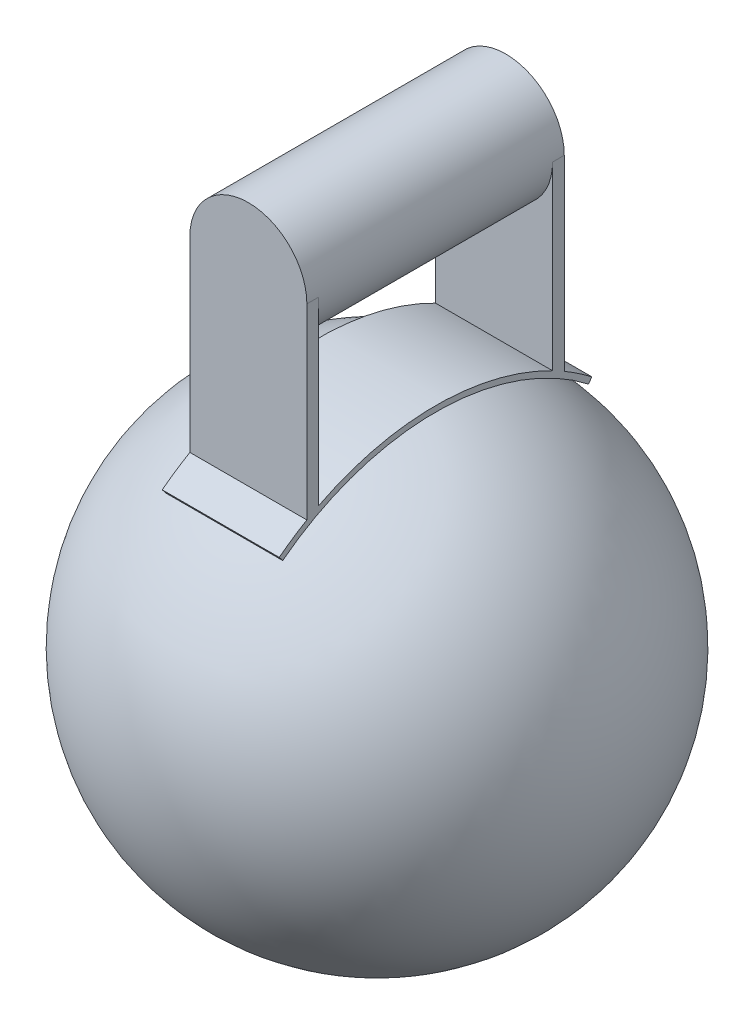
ISO-10303-21;
HEADER;
FILE_DESCRIPTION(('STEP AP214'),'2;1');
FILE_NAME('part.step','',(''),(''),'','','');
FILE_SCHEMA(('AUTOMOTIVE_DESIGN { 1 0 10303 214 1 1 1 1 }'));
ENDSEC;
DATA;
#1=APPLICATION_CONTEXT('core data for automotive mechanical design processes');
#2=APPLICATION_PROTOCOL_DEFINITION('international standard','automotive_design',2000,#1);
#3=PRODUCT_CONTEXT('',#1,'mechanical');
#4=PRODUCT('Part','Part','',(#3));
#5=PRODUCT_RELATED_PRODUCT_CATEGORY('part','',(#4));
#6=PRODUCT_DEFINITION_FORMATION('','',#4);
#7=PRODUCT_DEFINITION_CONTEXT('part definition',#1,'design');
#8=PRODUCT_DEFINITION('design','',#6,#7);
#9=PRODUCT_DEFINITION_SHAPE('','',#8);
#10=(LENGTH_UNIT() NAMED_UNIT(*) SI_UNIT(.MILLI.,.METRE.));
#11=(NAMED_UNIT(*) PLANE_ANGLE_UNIT() SI_UNIT($,.RADIAN.));
#12=(NAMED_UNIT(*) SI_UNIT($,.STERADIAN.) SOLID_ANGLE_UNIT());
#13=UNCERTAINTY_MEASURE_WITH_UNIT(LENGTH_MEASURE(1.E-05),#10,'distance_accuracy_value','');
#14=(GEOMETRIC_REPRESENTATION_CONTEXT(3) GLOBAL_UNCERTAINTY_ASSIGNED_CONTEXT((#13)) GLOBAL_UNIT_ASSIGNED_CONTEXT((#10,
#11,#12)) REPRESENTATION_CONTEXT('',''));
#15=CARTESIAN_POINT('',(0.,0.,0.));
#16=DIRECTION('',(0.,0.,1.));
#17=DIRECTION('',(1.,0.,0.));
#18=AXIS2_PLACEMENT_3D('',#15,#16,#17);
#19=CARTESIAN_POINT('',(560.90572399954,797.049874778435,1361.72805948292));
#20=DIRECTION('',(-3.47166739800286E-11,1.,0.));
#21=DIRECTION('',(-1.,-3.47166739800286E-11,0.));
#22=AXIS2_PLACEMENT_3D('',#19,#20,#21);
#23=SPHERICAL_SURFACE('',#22,20.);
#24=CARTESIAN_POINT('',(560.905723998846,817.049874778435,1361.72805948292));
#25=VERTEX_POINT('',#24);
#26=VERTEX_LOOP('',#25);
#27=FACE_BOUND('',#26,.T.);
#28=ADVANCED_FACE('F121',(#27),#23,.T.);
#29=CLOSED_SHELL('',(#28));
#30=MANIFOLD_SOLID_BREP('B2',#29);
#31=CARTESIAN_POINT('',(560.905723998939,830.454997706051,1371.72805948292));
#32=DIRECTION('',(0.,0.,-1.));
#33=DIRECTION('',(0.,1.,0.));
#34=AXIS2_PLACEMENT_3D('',#31,#32,#33);
#35=CYLINDRICAL_SURFACE('',#34,5.00000000038899);
#36=CARTESIAN_POINT('',(560.905723998939,830.454997706051,1371.72805948292));
#37=DIRECTION('',(0.,0.,1.));
#38=DIRECTION('',(0.,-1.,0.));
#39=AXIS2_PLACEMENT_3D('',#36,#37,#38);
#40=CIRCLE('',#39,5.00000000038899);
#41=CARTESIAN_POINT('',(555.905723998939,830.454997706051,1371.72805948292));
#42=VERTEX_POINT('',#41);
#43=CARTESIAN_POINT('',(565.905723999329,830.454997706051,1371.72805948291));
#44=VERTEX_POINT('',#43);
#45=EDGE_CURVE('E141',#42,#44,#40,.T.);
#46=ORIENTED_EDGE('',*,*,#45,.F.);
#47=DIRECTION('',(0.,0.,-1.));
#48=VECTOR('',#47,1.);
#49=CARTESIAN_POINT('',(555.90572399855,830.454997706051,1372.72805948291));
#50=LINE('',#49,#48);
#51=CARTESIAN_POINT('',(555.90572399855,830.454997706051,1372.72805948291));
#52=VERTEX_POINT('',#51);
#53=EDGE_CURVE('E306',#52,#42,#50,.T.);
#54=ORIENTED_EDGE('',*,*,#53,.F.);
#55=CARTESIAN_POINT('',(560.905723998939,830.454997706051,1372.72805948291));
#56=DIRECTION('',(0.,0.,1.));
#57=DIRECTION('',(1.,0.,0.));
#58=AXIS2_PLACEMENT_3D('',#55,#56,#57);
#59=CIRCLE('',#58,5.00000000038899);
#60=CARTESIAN_POINT('',(565.905723999329,830.454997706051,1372.72805948291));
#61=VERTEX_POINT('',#60);
#62=EDGE_CURVE('E288',#61,#52,#59,.T.);
#63=ORIENTED_EDGE('',*,*,#62,.F.);
#64=DIRECTION('',(0.,0.,-1.));
#65=VECTOR('',#64,1.);
#66=CARTESIAN_POINT('',(565.905723999329,830.454997706051,1372.72805948291));
#67=LINE('',#66,#65);
#68=EDGE_CURVE('E300',#61,#44,#67,.T.);
#69=ORIENTED_EDGE('',*,*,#68,.T.);
#70=EDGE_LOOP('',(#46,#54,#63,#69));
#71=FACE_BOUND('',#70,.T.);
#72=CARTESIAN_POINT('',(560.905723998939,830.454997706051,1351.72805948292));
#73=DIRECTION('',(0.,0.,1.));
#74=DIRECTION('',(0.,-1.,0.));
#75=AXIS2_PLACEMENT_3D('',#72,#73,#74);
#76=CIRCLE('',#75,5.00000000038899);
#77=CARTESIAN_POINT('',(555.90572399855,830.454997706051,1351.72805948292));
#78=VERTEX_POINT('',#77);
#79=CARTESIAN_POINT('',(565.905723998939,830.454997706051,1351.72805948292));
#80=VERTEX_POINT('',#79);
#81=EDGE_CURVE('E309',#78,#80,#76,.T.);
#82=ORIENTED_EDGE('',*,*,#81,.T.);
#83=DIRECTION('',(0.,0.,1.));
#84=VECTOR('',#83,1.);
#85=CARTESIAN_POINT('',(565.905723999329,830.454997706051,1350.72805948292));
#86=LINE('',#85,#84);
#87=CARTESIAN_POINT('',(565.905723999329,830.454997706051,1350.72805948292));
#88=VERTEX_POINT('',#87);
#89=EDGE_CURVE('E285',#88,#80,#86,.T.);
#90=ORIENTED_EDGE('',*,*,#89,.F.);
#91=CARTESIAN_POINT('',(560.905723998939,830.454997706051,1350.72805948292));
#92=DIRECTION('',(0.,0.,1.));
#93=DIRECTION('',(1.,0.,0.));
#94=AXIS2_PLACEMENT_3D('',#91,#92,#93);
#95=CIRCLE('',#94,5.00000000038899);
#96=CARTESIAN_POINT('',(555.90572399855,830.454997706051,1350.72805948292));
#97=VERTEX_POINT('',#96);
#98=EDGE_CURVE('E267',#88,#97,#95,.T.);
#99=ORIENTED_EDGE('',*,*,#98,.T.);
#100=DIRECTION('',(0.,0.,1.));
#101=VECTOR('',#100,1.);
#102=CARTESIAN_POINT('',(555.90572399855,830.454997706051,1350.72805948292));
#103=LINE('',#102,#101);
#104=EDGE_CURVE('E279',#97,#78,#103,.T.);
#105=ORIENTED_EDGE('',*,*,#104,.T.);
#106=EDGE_LOOP('',(#82,#90,#99,#105));
#107=FACE_BOUND('',#106,.T.);
#108=ADVANCED_FACE('F134',(#71,#107),#35,.T.);
#109=CARTESIAN_POINT('',(0.,0.,1371.72805948291));
#110=DIRECTION('',(0.,0.,1.));
#111=DIRECTION('',(1.,0.,0.));
#112=AXIS2_PLACEMENT_3D('',#109,#110,#111);
#113=PLANE('',#112);
#114=DIRECTION('',(0.,-1.,0.));
#115=VECTOR('',#114,1.);
#116=CARTESIAN_POINT('',(565.905723998939,0.,1371.72805948291));
#117=LINE('',#116,#115);
#118=CARTESIAN_POINT('',(565.905723998932,815.009793199456,1371.72805948291));
#119=VERTEX_POINT('',#118);
#120=EDGE_CURVE('E292',#44,#119,#117,.T.);
#121=ORIENTED_EDGE('',*,*,#120,.T.);
#122=DIRECTION('',(-1.,0.,0.));
#123=VECTOR('',#122,1.);
#124=CARTESIAN_POINT('',(565.905723998932,815.009793199456,1371.72805948291));
#125=LINE('',#124,#123);
#126=CARTESIAN_POINT('',(555.905723998932,815.009793199456,1371.72805948291));
#127=VERTEX_POINT('',#126);
#128=EDGE_CURVE('E249',#119,#127,#125,.T.);
#129=ORIENTED_EDGE('',*,*,#128,.T.);
#130=DIRECTION('',(0.,-1.,0.));
#131=VECTOR('',#130,1.);
#132=CARTESIAN_POINT('',(555.905723998939,0.,1371.72805948291));
#133=LINE('',#132,#131);
#134=EDGE_CURVE('E287',#42,#127,#133,.T.);
#135=ORIENTED_EDGE('',*,*,#134,.F.);
#136=ORIENTED_EDGE('',*,*,#45,.T.);
#137=EDGE_LOOP('',(#121,#129,#135,#136));
#138=FACE_BOUND('',#137,.T.);
#139=ADVANCED_FACE('F349',(#138),#113,.F.);
#140=CARTESIAN_POINT('',(555.905723998939,0.,1372.72805948291));
#141=DIRECTION('',(1.,0.,0.));
#142=DIRECTION('',(0.,0.,-1.));
#143=AXIS2_PLACEMENT_3D('',#140,#141,#142);
#144=PLANE('',#143);
#145=ORIENTED_EDGE('',*,*,#134,.T.);
#146=CARTESIAN_POINT('',(555.905723998932,795.548487920204,1361.72805948291));
#147=DIRECTION('',(-1.,0.,0.));
#148=DIRECTION('',(0.,0.,1.));
#149=AXIS2_PLACEMENT_3D('',#146,#147,#148);
#150=CIRCLE('',#149,21.880182887086);
#151=CARTESIAN_POINT('',(555.905723998932,815.009793199466,1351.72805948292));
#152=VERTEX_POINT('',#151);
#153=EDGE_CURVE('E318',#127,#152,#150,.T.);
#154=ORIENTED_EDGE('',*,*,#153,.T.);
#155=DIRECTION('',(0.,-1.,0.));
#156=VECTOR('',#155,1.);
#157=CARTESIAN_POINT('',(555.905723998939,1.59916102906686E-13,1351.72805948291));
#158=LINE('',#157,#156);
#159=EDGE_CURVE('E271',#78,#152,#158,.T.);
#160=ORIENTED_EDGE('',*,*,#159,.F.);
#161=ORIENTED_EDGE('',*,*,#104,.F.);
#162=DIRECTION('',(0.,-1.,0.));
#163=VECTOR('',#162,1.);
#164=CARTESIAN_POINT('',(555.905723998939,1.75907713197352E-13,1350.72805948291));
#165=LINE('',#164,#163);
#166=CARTESIAN_POINT('',(555.905723998932,814.462567415983,1350.72805948292));
#167=VERTEX_POINT('',#166);
#168=EDGE_CURVE('E276',#97,#167,#165,.T.);
#169=ORIENTED_EDGE('',*,*,#168,.T.);
#170=CARTESIAN_POINT('',(555.905723998932,812.875739584183,1348.36734270029));
#171=VERTEX_POINT('',#170);
#172=EDGE_CURVE('E320',#167,#171,#150,.T.);
#173=ORIENTED_EDGE('',*,*,#172,.T.);
#174=DIRECTION('',(0.,-0.791915303149285,0.6106309463481));
#175=VECTOR('',#174,1.);
#176=CARTESIAN_POINT('',(555.905723998932,955.124388120012,1238.68209413047));
#177=LINE('',#176,#175);
#178=CARTESIAN_POINT('',(555.905723998932,812.491448801711,1348.66366207086));
#179=VERTEX_POINT('',#178);
#180=EDGE_CURVE('E258',#171,#179,#177,.T.);
#181=ORIENTED_EDGE('',*,*,#180,.T.);
#182=CARTESIAN_POINT('',(555.905723998932,795.548487920204,1361.72805948291));
#183=DIRECTION('',(-1.,0.,0.));
#184=DIRECTION('',(0.,0.,1.));
#185=AXIS2_PLACEMENT_3D('',#182,#183,#184);
#186=CIRCLE('',#185,21.3949153579147);
#187=CARTESIAN_POINT('',(555.905723998932,812.491448801711,1374.79245689497));
#188=VERTEX_POINT('',#187);
#189=EDGE_CURVE('E262',#188,#179,#186,.T.);
#190=ORIENTED_EDGE('',*,*,#189,.F.);
#191=DIRECTION('',(0.,-0.791915303149285,-0.6106309463481));
#192=VECTOR('',#191,1.);
#193=CARTESIAN_POINT('',(555.905723998932,-361.851815876597,469.278526053737));
#194=LINE('',#193,#192);
#195=CARTESIAN_POINT('',(555.905723998932,812.875739584183,1375.08877626553));
#196=VERTEX_POINT('',#195);
#197=EDGE_CURVE('E246',#196,#188,#194,.T.);
#198=ORIENTED_EDGE('',*,*,#197,.F.);
#199=CARTESIAN_POINT('',(555.905723998932,814.462567415972,1372.72805948291));
#200=VERTEX_POINT('',#199);
#201=EDGE_CURVE('E234',#196,#200,#150,.T.);
#202=ORIENTED_EDGE('',*,*,#201,.T.);
#203=DIRECTION('',(0.,-1.,0.));
#204=VECTOR('',#203,1.);
#205=CARTESIAN_POINT('',(555.905723998939,0.,1372.72805948291));
#206=LINE('',#205,#204);
#207=EDGE_CURVE('E291',#52,#200,#206,.T.);
#208=ORIENTED_EDGE('',*,*,#207,.F.);
#209=ORIENTED_EDGE('',*,*,#53,.T.);
#210=EDGE_LOOP('',(#145,#154,#160,#161,#169,#173,#181,#190,#198,#202,#208,#209));
#211=FACE_BOUND('',#210,.T.);
#212=ADVANCED_FACE('F317',(#211),#144,.F.);
#213=CARTESIAN_POINT('',(565.905723998939,0.,1372.72805948291));
#214=DIRECTION('',(1.,0.,0.));
#215=DIRECTION('',(0.,0.,-1.));
#216=AXIS2_PLACEMENT_3D('',#213,#214,#215);
#217=PLANE('',#216);
#218=DIRECTION('',(0.,-1.,0.));
#219=VECTOR('',#218,1.);
#220=CARTESIAN_POINT('',(565.905723998939,0.,1372.72805948291));
#221=LINE('',#220,#219);
#222=CARTESIAN_POINT('',(565.905723998939,814.462567416319,1372.72805948291));
#223=VERTEX_POINT('',#222);
#224=EDGE_CURVE('E298',#61,#223,#221,.T.);
#225=ORIENTED_EDGE('',*,*,#224,.T.);
#226=CARTESIAN_POINT('',(565.905723998932,795.548487920204,1361.72805948291));
#227=DIRECTION('',(-1.,0.,0.));
#228=DIRECTION('',(0.,0.,1.));
#229=AXIS2_PLACEMENT_3D('',#226,#227,#228);
#230=CIRCLE('',#229,21.880182887086);
#231=CARTESIAN_POINT('',(565.905723998932,812.875739584183,1375.08877626553));
#232=VERTEX_POINT('',#231);
#233=EDGE_CURVE('E240',#232,#223,#230,.T.);
#234=ORIENTED_EDGE('',*,*,#233,.F.);
#235=DIRECTION('',(0.,-0.791915303149285,-0.6106309463481));
#236=VECTOR('',#235,1.);
#237=CARTESIAN_POINT('',(565.905723998932,-361.851815876597,469.278526053737));
#238=LINE('',#237,#236);
#239=CARTESIAN_POINT('',(565.905723998932,812.491448801711,1374.79245689497));
#240=VERTEX_POINT('',#239);
#241=EDGE_CURVE('E233',#232,#240,#238,.T.);
#242=ORIENTED_EDGE('',*,*,#241,.T.);
#243=CARTESIAN_POINT('',(565.905723998932,795.548487920204,1361.72805948291));
#244=DIRECTION('',(-1.,0.,0.));
#245=DIRECTION('',(0.,0.,1.));
#246=AXIS2_PLACEMENT_3D('',#243,#244,#245);
#247=CIRCLE('',#246,21.3949153579147);
#248=CARTESIAN_POINT('',(565.905723998932,812.491448801711,1348.66366207086));
#249=VERTEX_POINT('',#248);
#250=EDGE_CURVE('E222',#240,#249,#247,.T.);
#251=ORIENTED_EDGE('',*,*,#250,.T.);
#252=DIRECTION('',(0.,-0.791915303149285,0.6106309463481));
#253=VECTOR('',#252,1.);
#254=CARTESIAN_POINT('',(565.905723998932,955.124388120012,1238.68209413047));
#255=LINE('',#254,#253);
#256=CARTESIAN_POINT('',(565.905723998932,812.875739584183,1348.36734270029));
#257=VERTEX_POINT('',#256);
#258=EDGE_CURVE('E255',#257,#249,#255,.T.);
#259=ORIENTED_EDGE('',*,*,#258,.F.);
#260=CARTESIAN_POINT('',(565.905723998932,814.462567415983,1350.72805948292));
#261=VERTEX_POINT('',#260);
#262=EDGE_CURVE('E242',#261,#257,#230,.T.);
#263=ORIENTED_EDGE('',*,*,#262,.F.);
#264=DIRECTION('',(0.,-1.,0.));
#265=VECTOR('',#264,1.);
#266=CARTESIAN_POINT('',(565.905723998939,1.75907713197352E-13,1350.72805948291));
#267=LINE('',#266,#265);
#268=EDGE_CURVE('E270',#88,#261,#267,.T.);
#269=ORIENTED_EDGE('',*,*,#268,.F.);
#270=ORIENTED_EDGE('',*,*,#89,.T.);
#271=DIRECTION('',(0.,-1.,0.));
#272=VECTOR('',#271,1.);
#273=CARTESIAN_POINT('',(565.905723998939,1.59916102906686E-13,1351.72805948291));
#274=LINE('',#273,#272);
#275=CARTESIAN_POINT('',(565.905723998932,815.009793199466,1351.72805948292));
#276=VERTEX_POINT('',#275);
#277=EDGE_CURVE('E147',#80,#276,#274,.T.);
#278=ORIENTED_EDGE('',*,*,#277,.T.);
#279=EDGE_CURVE('E251',#119,#276,#230,.T.);
#280=ORIENTED_EDGE('',*,*,#279,.F.);
#281=ORIENTED_EDGE('',*,*,#120,.F.);
#282=ORIENTED_EDGE('',*,*,#68,.F.);
#283=EDGE_LOOP('',(#225,#234,#242,#251,#259,#263,#269,#270,#278,#280,#281,#282));
#284=FACE_BOUND('',#283,.T.);
#285=ADVANCED_FACE('F239',(#284),#217,.T.);
#286=CARTESIAN_POINT('',(0.,0.,1372.72805948291));
#287=DIRECTION('',(0.,0.,1.));
#288=DIRECTION('',(1.,0.,0.));
#289=AXIS2_PLACEMENT_3D('',#286,#287,#288);
#290=PLANE('',#289);
#291=ORIENTED_EDGE('',*,*,#62,.T.);
#292=ORIENTED_EDGE('',*,*,#207,.T.);
#293=DIRECTION('',(1.,0.,0.));
#294=VECTOR('',#293,1.);
#295=CARTESIAN_POINT('',(0.,814.462567416319,1372.72805948291));
#296=LINE('',#295,#294);
#297=EDGE_CURVE('E295',#200,#223,#296,.T.);
#298=ORIENTED_EDGE('',*,*,#297,.T.);
#299=ORIENTED_EDGE('',*,*,#224,.F.);
#300=EDGE_LOOP('',(#291,#292,#298,#299));
#301=FACE_BOUND('',#300,.T.);
#302=ADVANCED_FACE('F337',(#301),#290,.T.);
#303=CARTESIAN_POINT('',(0.,1.75907713197327E-13,1350.72805948291));
#304=DIRECTION('',(0.,0.,-1.));
#305=DIRECTION('',(1.,0.,0.));
#306=AXIS2_PLACEMENT_3D('',#303,#304,#305);
#307=PLANE('',#306);
#308=ORIENTED_EDGE('',*,*,#98,.F.);
#309=ORIENTED_EDGE('',*,*,#268,.T.);
#310=DIRECTION('',(1.,0.,0.));
#311=VECTOR('',#310,1.);
#312=CARTESIAN_POINT('',(0.,814.462567416319,1350.72805948293));
#313=LINE('',#312,#311);
#314=EDGE_CURVE('E274',#167,#261,#313,.T.);
#315=ORIENTED_EDGE('',*,*,#314,.F.);
#316=ORIENTED_EDGE('',*,*,#168,.F.);
#317=EDGE_LOOP('',(#308,#309,#315,#316));
#318=FACE_BOUND('',#317,.T.);
#319=ADVANCED_FACE('F335',(#318),#307,.T.);
#320=CARTESIAN_POINT('',(0.,1.59916102906661E-13,1351.72805948291));
#321=DIRECTION('',(0.,0.,-1.));
#322=DIRECTION('',(1.,0.,0.));
#323=AXIS2_PLACEMENT_3D('',#320,#321,#322);
#324=PLANE('',#323);
#325=ORIENTED_EDGE('',*,*,#159,.T.);
#326=DIRECTION('',(-1.,0.,0.));
#327=VECTOR('',#326,1.);
#328=CARTESIAN_POINT('',(565.905723998932,815.009793199466,1351.72805948292));
#329=LINE('',#328,#327);
#330=EDGE_CURVE('E119',#152,#276,#329,.F.);
#331=ORIENTED_EDGE('',*,*,#330,.T.);
#332=ORIENTED_EDGE('',*,*,#277,.F.);
#333=ORIENTED_EDGE('',*,*,#81,.F.);
#334=EDGE_LOOP('',(#325,#331,#332,#333));
#335=FACE_BOUND('',#334,.T.);
#336=ADVANCED_FACE('F314',(#335),#324,.F.);
#337=CARTESIAN_POINT('',(565.905723998932,795.548487920204,1361.72805948291));
#338=DIRECTION('',(-1.,0.,0.));
#339=DIRECTION('',(0.,0.,1.));
#340=AXIS2_PLACEMENT_3D('',#337,#338,#339);
#341=CYLINDRICAL_SURFACE('',#340,21.880182887086);
#342=ORIENTED_EDGE('',*,*,#128,.F.);
#343=ORIENTED_EDGE('',*,*,#279,.T.);
#344=ORIENTED_EDGE('',*,*,#330,.F.);
#345=ORIENTED_EDGE('',*,*,#153,.F.);
#346=EDGE_LOOP('',(#342,#343,#344,#345));
#347=FACE_BOUND('',#346,.T.);
#348=ADVANCED_FACE('F343',(#347),#341,.T.);
#349=ORIENTED_EDGE('',*,*,#233,.T.);
#350=ORIENTED_EDGE('',*,*,#297,.F.);
#351=ORIENTED_EDGE('',*,*,#201,.F.);
#352=DIRECTION('',(-1.,0.,0.));
#353=VECTOR('',#352,1.);
#354=CARTESIAN_POINT('',(565.905723998932,812.875739584183,1375.08877626553));
#355=LINE('',#354,#353);
#356=EDGE_CURVE('E247',#232,#196,#355,.T.);
#357=ORIENTED_EDGE('',*,*,#356,.F.);
#358=EDGE_LOOP('',(#349,#350,#351,#357));
#359=FACE_BOUND('',#358,.T.);
#360=ADVANCED_FACE('F456',(#359),#341,.T.);
#361=CARTESIAN_POINT('',(565.905723998932,795.548487920204,1361.72805948291));
#362=DIRECTION('',(-1.,0.,0.));
#363=DIRECTION('',(0.,0.,1.));
#364=AXIS2_PLACEMENT_3D('',#361,#362,#363);
#365=CYLINDRICAL_SURFACE('',#364,21.3949153579147);
#366=ORIENTED_EDGE('',*,*,#189,.T.);
#367=DIRECTION('',(-1.,0.,0.));
#368=VECTOR('',#367,1.);
#369=CARTESIAN_POINT('',(565.905723998932,812.491448801711,1348.66366207086));
#370=LINE('',#369,#368);
#371=EDGE_CURVE('E229',#249,#179,#370,.T.);
#372=ORIENTED_EDGE('',*,*,#371,.F.);
#373=ORIENTED_EDGE('',*,*,#250,.F.);
#374=DIRECTION('',(-1.,0.,0.));
#375=VECTOR('',#374,1.);
#376=CARTESIAN_POINT('',(565.905723998932,812.491448801711,1374.79245689497));
#377=LINE('',#376,#375);
#378=EDGE_CURVE('E226',#240,#188,#377,.T.);
#379=ORIENTED_EDGE('',*,*,#378,.T.);
#380=EDGE_LOOP('',(#366,#372,#373,#379));
#381=FACE_BOUND('',#380,.T.);
#382=ADVANCED_FACE('F224',(#381),#365,.F.);
#383=ORIENTED_EDGE('',*,*,#172,.F.);
#384=ORIENTED_EDGE('',*,*,#314,.T.);
#385=ORIENTED_EDGE('',*,*,#262,.T.);
#386=DIRECTION('',(-1.,0.,0.));
#387=VECTOR('',#386,1.);
#388=CARTESIAN_POINT('',(565.905723998932,812.875739584183,1348.36734270029));
#389=LINE('',#388,#387);
#390=EDGE_CURVE('E257',#257,#171,#389,.T.);
#391=ORIENTED_EDGE('',*,*,#390,.T.);
#392=EDGE_LOOP('',(#383,#384,#385,#391));
#393=FACE_BOUND('',#392,.T.);
#394=ADVANCED_FACE('F331',(#393),#341,.T.);
#395=CARTESIAN_POINT('',(565.905723998932,-361.851815876597,469.278526053737));
#396=DIRECTION('',(0.,0.610630946348099,-0.791915303149285));
#397=DIRECTION('',(0.,0.791915303149285,0.6106309463481));
#398=AXIS2_PLACEMENT_3D('',#395,#396,#397);
#399=PLANE('',#398);
#400=ORIENTED_EDGE('',*,*,#197,.T.);
#401=ORIENTED_EDGE('',*,*,#378,.F.);
#402=ORIENTED_EDGE('',*,*,#241,.F.);
#403=ORIENTED_EDGE('',*,*,#356,.T.);
#404=EDGE_LOOP('',(#400,#401,#402,#403));
#405=FACE_BOUND('',#404,.T.);
#406=ADVANCED_FACE('F244',(#405),#399,.F.);
#407=CARTESIAN_POINT('',(565.905723998932,955.124388120012,1238.68209413047));
#408=DIRECTION('',(0.,-0.610630946348099,-0.791915303149285));
#409=DIRECTION('',(0.,0.791915303149285,-0.6106309463481));
#410=AXIS2_PLACEMENT_3D('',#407,#408,#409);
#411=PLANE('',#410);
#412=ORIENTED_EDGE('',*,*,#180,.F.);
#413=ORIENTED_EDGE('',*,*,#390,.F.);
#414=ORIENTED_EDGE('',*,*,#258,.T.);
#415=ORIENTED_EDGE('',*,*,#371,.T.);
#416=EDGE_LOOP('',(#412,#413,#414,#415));
#417=FACE_BOUND('',#416,.T.);
#418=ADVANCED_FACE('F326',(#417),#411,.T.);
#419=CLOSED_SHELL('',(#108,#139,#212,#285,#302,#319,#336,#348,#360,#382,#394,#406,#418));
#420=MANIFOLD_SOLID_BREP('B7',#419);
#421=ADVANCED_BREP_SHAPE_REPRESENTATION('',(#18,#30,#420),#14);
#422=SHAPE_DEFINITION_REPRESENTATION(#9,#421);
ENDSEC;
END-ISO-10303-21;
